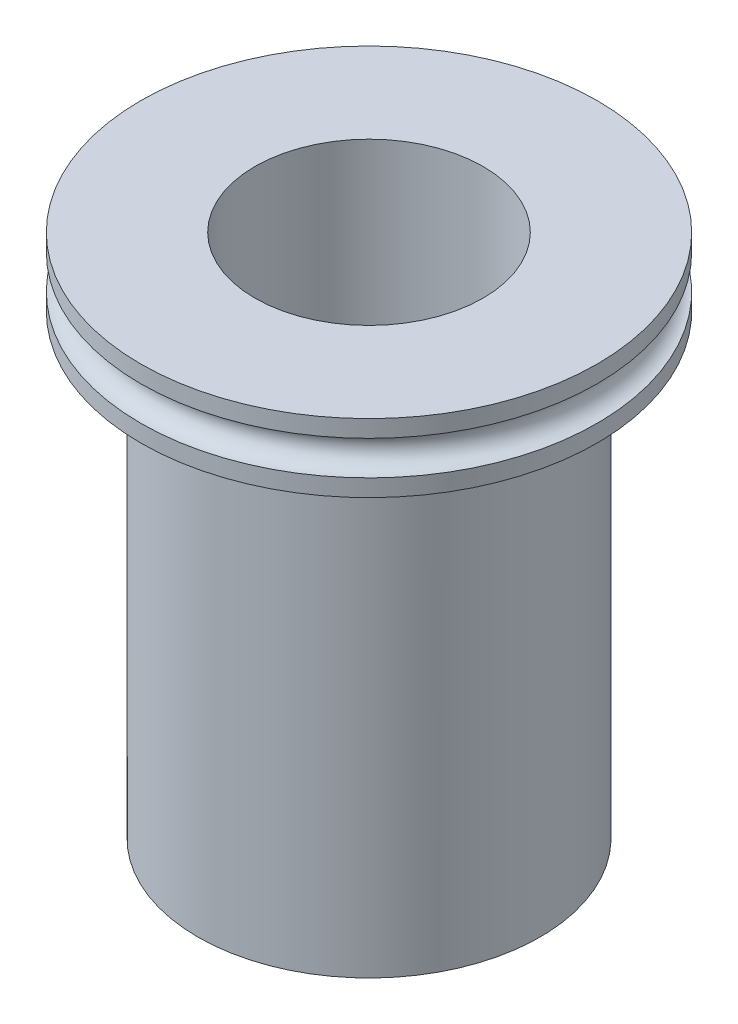
ISO-10303-21;
HEADER;
FILE_DESCRIPTION(('STEP AP214'),'2;1');
FILE_NAME('part.step','',(''),(''),'','','');
FILE_SCHEMA(('AUTOMOTIVE_DESIGN { 1 0 10303 214 1 1 1 1 }'));
ENDSEC;
DATA;
#1=APPLICATION_CONTEXT('core data for automotive mechanical design processes');
#2=APPLICATION_PROTOCOL_DEFINITION('international standard','automotive_design',2000,#1);
#3=PRODUCT_CONTEXT('',#1,'mechanical');
#4=PRODUCT('Part','Part','',(#3));
#5=PRODUCT_RELATED_PRODUCT_CATEGORY('part','',(#4));
#6=PRODUCT_DEFINITION_FORMATION('','',#4);
#7=PRODUCT_DEFINITION_CONTEXT('part definition',#1,'design');
#8=PRODUCT_DEFINITION('design','',#6,#7);
#9=PRODUCT_DEFINITION_SHAPE('','',#8);
#10=(LENGTH_UNIT() NAMED_UNIT(*) SI_UNIT(.MILLI.,.METRE.));
#11=(NAMED_UNIT(*) PLANE_ANGLE_UNIT() SI_UNIT($,.RADIAN.));
#12=(NAMED_UNIT(*) SI_UNIT($,.STERADIAN.) SOLID_ANGLE_UNIT());
#13=UNCERTAINTY_MEASURE_WITH_UNIT(LENGTH_MEASURE(1.E-05),#10,'distance_accuracy_value','');
#14=(GEOMETRIC_REPRESENTATION_CONTEXT(3) GLOBAL_UNCERTAINTY_ASSIGNED_CONTEXT((#13)) GLOBAL_UNIT_ASSIGNED_CONTEXT((#10,
#11,#12)) REPRESENTATION_CONTEXT('',''));
#15=CARTESIAN_POINT('',(0.,0.,0.));
#16=DIRECTION('',(0.,0.,1.));
#17=DIRECTION('',(1.,0.,0.));
#18=AXIS2_PLACEMENT_3D('',#15,#16,#17);
#19=CARTESIAN_POINT('',(0.,0.,0.));
#20=DIRECTION('',(0.,1.,0.));
#21=DIRECTION('',(0.,0.,1.));
#22=AXIS2_PLACEMENT_3D('',#19,#20,#21);
#23=PLANE('',#22);
#24=CARTESIAN_POINT('',(0.,0.,0.));
#25=DIRECTION('',(0.,1.,0.));
#26=DIRECTION('',(0.,0.,1.));
#27=AXIS2_PLACEMENT_3D('',#24,#25,#26);
#28=CIRCLE('',#27,10.);
#29=CARTESIAN_POINT('',(0.,0.,10.));
#30=VERTEX_POINT('',#29);
#31=EDGE_CURVE('E44',#30,#30,#28,.T.);
#32=ORIENTED_EDGE('',*,*,#31,.F.);
#33=EDGE_LOOP('',(#32));
#34=FACE_BOUND('',#33,.T.);
#35=CARTESIAN_POINT('',(0.,0.,0.));
#36=DIRECTION('',(0.,1.,0.));
#37=DIRECTION('',(0.,0.,1.));
#38=AXIS2_PLACEMENT_3D('',#35,#36,#37);
#39=CIRCLE('',#38,7.5);
#40=CARTESIAN_POINT('',(0.,0.,7.5));
#41=VERTEX_POINT('',#40);
#42=EDGE_CURVE('E10',#41,#41,#39,.F.);
#43=ORIENTED_EDGE('',*,*,#42,.F.);
#44=EDGE_LOOP('',(#43));
#45=FACE_BOUND('',#44,.T.);
#46=ADVANCED_FACE('F33',(#34,#45),#23,.F.);
#47=CARTESIAN_POINT('',(0.,3.,0.));
#48=DIRECTION('',(0.,-1.,0.));
#49=DIRECTION('',(0.,0.,-1.));
#50=AXIS2_PLACEMENT_3D('',#47,#48,#49);
#51=CYLINDRICAL_SURFACE('',#50,10.);
#52=CARTESIAN_POINT('',(0.,3.,0.));
#53=DIRECTION('',(0.,1.,0.));
#54=DIRECTION('',(0.,0.,1.));
#55=AXIS2_PLACEMENT_3D('',#52,#53,#54);
#56=CIRCLE('',#55,10.);
#57=CARTESIAN_POINT('',(0.,3.,10.));
#58=VERTEX_POINT('',#57);
#59=EDGE_CURVE('E40',#58,#58,#56,.T.);
#60=ORIENTED_EDGE('',*,*,#59,.F.);
#61=EDGE_LOOP('',(#60));
#62=FACE_BOUND('',#61,.T.);
#63=CARTESIAN_POINT('',(0.,2.25,0.));
#64=DIRECTION('',(0.,-1.,0.));
#65=DIRECTION('',(0.,0.,-1.));
#66=AXIS2_PLACEMENT_3D('',#63,#64,#65);
#67=CIRCLE('',#66,10.);
#68=CARTESIAN_POINT('',(0.,2.25,-10.));
#69=VERTEX_POINT('',#68);
#70=EDGE_CURVE('E49',#69,#69,#67,.T.);
#71=ORIENTED_EDGE('',*,*,#70,.F.);
#72=EDGE_LOOP('',(#71));
#73=FACE_BOUND('',#72,.T.);
#74=ADVANCED_FACE('F35',(#62,#73),#51,.T.);
#75=CARTESIAN_POINT('',(0.,3.,0.));
#76=DIRECTION('',(0.,1.,0.));
#77=DIRECTION('',(0.,0.,1.));
#78=AXIS2_PLACEMENT_3D('',#75,#76,#77);
#79=PLANE('',#78);
#80=CARTESIAN_POINT('',(0.,3.,0.));
#81=DIRECTION('',(0.,1.,0.));
#82=DIRECTION('',(0.,0.,1.));
#83=AXIS2_PLACEMENT_3D('',#80,#81,#82);
#84=CIRCLE('',#83,5.);
#85=CARTESIAN_POINT('',(0.,3.,5.));
#86=VERTEX_POINT('',#85);
#87=EDGE_CURVE('E106',#86,#86,#84,.T.);
#88=ORIENTED_EDGE('',*,*,#87,.F.);
#89=EDGE_LOOP('',(#88));
#90=FACE_BOUND('',#89,.T.);
#91=ORIENTED_EDGE('',*,*,#59,.T.);
#92=EDGE_LOOP('',(#91));
#93=FACE_BOUND('',#92,.T.);
#94=ADVANCED_FACE('F63',(#90,#93),#79,.T.);
#95=CARTESIAN_POINT('',(0.,1.5,0.));
#96=DIRECTION('',(0.,1.,0.));
#97=DIRECTION('',(0.,0.,1.));
#98=AXIS2_PLACEMENT_3D('',#95,#96,#97);
#99=TOROIDAL_SURFACE('',#98,10.,0.75);
#100=CARTESIAN_POINT('',(0.,0.75,0.));
#101=DIRECTION('',(0.,1.,0.));
#102=DIRECTION('',(0.,0.,1.));
#103=AXIS2_PLACEMENT_3D('',#100,#101,#102);
#104=CIRCLE('',#103,10.);
#105=CARTESIAN_POINT('',(0.,0.75,10.));
#106=VERTEX_POINT('',#105);
#107=EDGE_CURVE('E55',#106,#106,#104,.T.);
#108=ORIENTED_EDGE('',*,*,#107,.T.);
#109=EDGE_LOOP('',(#108));
#110=FACE_BOUND('',#109,.T.);
#111=ORIENTED_EDGE('',*,*,#70,.T.);
#112=EDGE_LOOP('',(#111));
#113=FACE_BOUND('',#112,.T.);
#114=ADVANCED_FACE('F60',(#110,#113),#99,.F.);
#115=ORIENTED_EDGE('',*,*,#31,.T.);
#116=EDGE_LOOP('',(#115));
#117=FACE_BOUND('',#116,.T.);
#118=ORIENTED_EDGE('',*,*,#107,.F.);
#119=EDGE_LOOP('',(#118));
#120=FACE_BOUND('',#119,.T.);
#121=ADVANCED_FACE('F65',(#117,#120),#51,.T.);
#122=CARTESIAN_POINT('',(0.,-20.,0.));
#123=DIRECTION('',(0.,1.,0.));
#124=DIRECTION('',(0.,0.,1.));
#125=AXIS2_PLACEMENT_3D('',#122,#123,#124);
#126=CYLINDRICAL_SURFACE('',#125,7.5);
#127=CARTESIAN_POINT('',(0.,-20.,0.));
#128=DIRECTION('',(0.,-1.,0.));
#129=DIRECTION('',(0.,0.,-1.));
#130=AXIS2_PLACEMENT_3D('',#127,#128,#129);
#131=CIRCLE('',#130,7.5);
#132=CARTESIAN_POINT('',(0.,-20.,-7.5));
#133=VERTEX_POINT('',#132);
#134=EDGE_CURVE('E52',#133,#133,#131,.T.);
#135=ORIENTED_EDGE('',*,*,#134,.F.);
#136=EDGE_LOOP('',(#135));
#137=FACE_BOUND('',#136,.T.);
#138=ORIENTED_EDGE('',*,*,#42,.T.);
#139=EDGE_LOOP('',(#138));
#140=FACE_BOUND('',#139,.T.);
#141=ADVANCED_FACE('F74',(#137,#140),#126,.T.);
#142=CARTESIAN_POINT('',(0.,-20.,0.));
#143=DIRECTION('',(0.,-1.,0.));
#144=DIRECTION('',(0.,0.,-1.));
#145=AXIS2_PLACEMENT_3D('',#142,#143,#144);
#146=PLANE('',#145);
#147=CARTESIAN_POINT('',(0.,-20.,0.));
#148=DIRECTION('',(0.,1.,0.));
#149=DIRECTION('',(0.,0.,1.));
#150=AXIS2_PLACEMENT_3D('',#147,#148,#149);
#151=CIRCLE('',#150,5.);
#152=CARTESIAN_POINT('',(0.,-20.,5.));
#153=VERTEX_POINT('',#152);
#154=EDGE_CURVE('E103',#153,#153,#151,.T.);
#155=ORIENTED_EDGE('',*,*,#154,.T.);
#156=EDGE_LOOP('',(#155));
#157=FACE_BOUND('',#156,.T.);
#158=ORIENTED_EDGE('',*,*,#134,.T.);
#159=EDGE_LOOP('',(#158));
#160=FACE_BOUND('',#159,.T.);
#161=ADVANCED_FACE('F80',(#157,#160),#146,.T.);
#162=CARTESIAN_POINT('',(0.,-20.,0.));
#163=DIRECTION('',(0.,1.,0.));
#164=DIRECTION('',(0.,0.,1.));
#165=AXIS2_PLACEMENT_3D('',#162,#163,#164);
#166=CYLINDRICAL_SURFACE('',#165,5.);
#167=ORIENTED_EDGE('',*,*,#154,.F.);
#168=EDGE_LOOP('',(#167));
#169=FACE_BOUND('',#168,.T.);
#170=ORIENTED_EDGE('',*,*,#87,.T.);
#171=EDGE_LOOP('',(#170));
#172=FACE_BOUND('',#171,.T.);
#173=ADVANCED_FACE('F94',(#169,#172),#166,.F.);
#174=CLOSED_SHELL('',(#46,#74,#94,#114,#121,#141,#161,#173));
#175=MANIFOLD_SOLID_BREP('B2',#174);
#176=ADVANCED_BREP_SHAPE_REPRESENTATION('',(#18,#175),#14);
#177=SHAPE_DEFINITION_REPRESENTATION(#9,#176);
ENDSEC;
END-ISO-10303-21;
